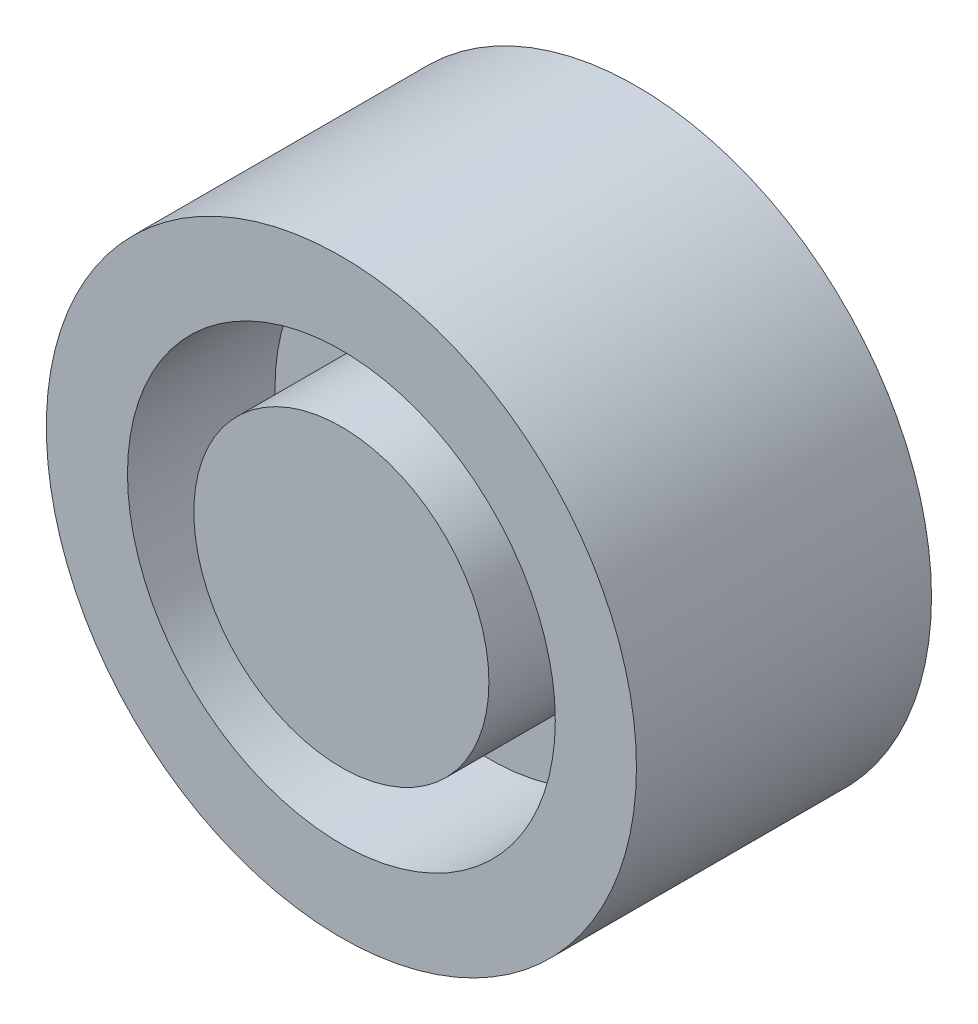
ISO-10303-21;
HEADER;
FILE_DESCRIPTION(('STEP AP214'),'2;1');
FILE_NAME('part.step','',(''),(''),'','','');
FILE_SCHEMA(('AUTOMOTIVE_DESIGN { 1 0 10303 214 1 1 1 1 }'));
ENDSEC;
DATA;
#1=APPLICATION_CONTEXT('core data for automotive mechanical design processes');
#2=APPLICATION_PROTOCOL_DEFINITION('international standard','automotive_design',2000,#1);
#3=PRODUCT_CONTEXT('',#1,'mechanical');
#4=PRODUCT('Part','Part','',(#3));
#5=PRODUCT_RELATED_PRODUCT_CATEGORY('part','',(#4));
#6=PRODUCT_DEFINITION_FORMATION('','',#4);
#7=PRODUCT_DEFINITION_CONTEXT('part definition',#1,'design');
#8=PRODUCT_DEFINITION('design','',#6,#7);
#9=PRODUCT_DEFINITION_SHAPE('','',#8);
#10=(LENGTH_UNIT() NAMED_UNIT(*) SI_UNIT(.MILLI.,.METRE.));
#11=(NAMED_UNIT(*) PLANE_ANGLE_UNIT() SI_UNIT($,.RADIAN.));
#12=(NAMED_UNIT(*) SI_UNIT($,.STERADIAN.) SOLID_ANGLE_UNIT());
#13=UNCERTAINTY_MEASURE_WITH_UNIT(LENGTH_MEASURE(1.E-05),#10,'distance_accuracy_value','');
#14=(GEOMETRIC_REPRESENTATION_CONTEXT(3) GLOBAL_UNCERTAINTY_ASSIGNED_CONTEXT((#13)) GLOBAL_UNIT_ASSIGNED_CONTEXT((#10,
#11,#12)) REPRESENTATION_CONTEXT('',''));
#15=CARTESIAN_POINT('',(0.,0.,0.));
#16=DIRECTION('',(0.,0.,1.));
#17=DIRECTION('',(1.,0.,0.));
#18=AXIS2_PLACEMENT_3D('',#15,#16,#17);
#19=CARTESIAN_POINT('',(0.,0.,2.));
#20=DIRECTION('',(0.,0.,-1.));
#21=DIRECTION('',(-1.,0.,0.));
#22=AXIS2_PLACEMENT_3D('',#19,#20,#21);
#23=CYLINDRICAL_SURFACE('',#22,2.);
#24=CARTESIAN_POINT('',(0.,0.,2.));
#25=DIRECTION('',(0.,0.,1.));
#26=DIRECTION('',(1.,0.,0.));
#27=AXIS2_PLACEMENT_3D('',#24,#25,#26);
#28=CIRCLE('',#27,2.);
#29=CARTESIAN_POINT('',(2.,0.,2.));
#30=VERTEX_POINT('',#29);
#31=EDGE_CURVE('E10',#30,#30,#28,.T.);
#32=ORIENTED_EDGE('',*,*,#31,.F.);
#33=EDGE_LOOP('',(#32));
#34=FACE_BOUND('',#33,.T.);
#35=CARTESIAN_POINT('',(0.,0.,0.));
#36=DIRECTION('',(0.,0.,1.));
#37=DIRECTION('',(1.,0.,0.));
#38=AXIS2_PLACEMENT_3D('',#35,#36,#37);
#39=CIRCLE('',#38,2.);
#40=CARTESIAN_POINT('',(2.,0.,0.));
#41=VERTEX_POINT('',#40);
#42=EDGE_CURVE('E39',#41,#41,#39,.T.);
#43=ORIENTED_EDGE('',*,*,#42,.T.);
#44=EDGE_LOOP('',(#43));
#45=FACE_BOUND('',#44,.T.);
#46=ADVANCED_FACE('F36',(#34,#45),#23,.T.);
#47=CARTESIAN_POINT('',(0.,0.,2.));
#48=DIRECTION('',(0.,0.,1.));
#49=DIRECTION('',(1.,0.,0.));
#50=AXIS2_PLACEMENT_3D('',#47,#48,#49);
#51=PLANE('',#50);
#52=CARTESIAN_POINT('',(0.,0.,2.));
#53=DIRECTION('',(0.,0.,1.));
#54=DIRECTION('',(1.,0.,0.));
#55=AXIS2_PLACEMENT_3D('',#52,#53,#54);
#56=CIRCLE('',#55,1.45);
#57=CARTESIAN_POINT('',(1.45,0.,2.));
#58=VERTEX_POINT('',#57);
#59=EDGE_CURVE('E50',#58,#58,#56,.T.);
#60=ORIENTED_EDGE('',*,*,#59,.F.);
#61=EDGE_LOOP('',(#60));
#62=FACE_BOUND('',#61,.T.);
#63=ORIENTED_EDGE('',*,*,#31,.T.);
#64=EDGE_LOOP('',(#63));
#65=FACE_BOUND('',#64,.T.);
#66=ADVANCED_FACE('F82',(#62,#65),#51,.T.);
#67=CARTESIAN_POINT('',(0.,0.,0.));
#68=DIRECTION('',(0.,0.,1.));
#69=DIRECTION('',(1.,0.,0.));
#70=AXIS2_PLACEMENT_3D('',#67,#68,#69);
#71=PLANE('',#70);
#72=ORIENTED_EDGE('',*,*,#42,.F.);
#73=EDGE_LOOP('',(#72));
#74=FACE_BOUND('',#73,.T.);
#75=ADVANCED_FACE('F78',(#74),#71,.F.);
#76=CARTESIAN_POINT('',(0.,0.,1.));
#77=DIRECTION('',(0.,0.,1.));
#78=DIRECTION('',(1.,0.,0.));
#79=AXIS2_PLACEMENT_3D('',#76,#77,#78);
#80=CYLINDRICAL_SURFACE('',#79,1.45);
#81=CARTESIAN_POINT('',(0.,0.,1.));
#82=DIRECTION('',(0.,0.,1.));
#83=DIRECTION('',(1.,0.,0.));
#84=AXIS2_PLACEMENT_3D('',#81,#82,#83);
#85=CIRCLE('',#84,1.45);
#86=CARTESIAN_POINT('',(1.45,0.,1.));
#87=VERTEX_POINT('',#86);
#88=EDGE_CURVE('E48',#87,#87,#85,.T.);
#89=ORIENTED_EDGE('',*,*,#88,.F.);
#90=EDGE_LOOP('',(#89));
#91=FACE_BOUND('',#90,.T.);
#92=ORIENTED_EDGE('',*,*,#59,.T.);
#93=EDGE_LOOP('',(#92));
#94=FACE_BOUND('',#93,.T.);
#95=ADVANCED_FACE('F72',(#91,#94),#80,.F.);
#96=CARTESIAN_POINT('',(0.,0.,1.));
#97=DIRECTION('',(0.,0.,1.));
#98=DIRECTION('',(1.,0.,0.));
#99=AXIS2_PLACEMENT_3D('',#96,#97,#98);
#100=PLANE('',#99);
#101=CARTESIAN_POINT('',(0.,0.,1.));
#102=DIRECTION('',(0.,0.,1.));
#103=DIRECTION('',(1.,0.,0.));
#104=AXIS2_PLACEMENT_3D('',#101,#102,#103);
#105=CIRCLE('',#104,1.);
#106=CARTESIAN_POINT('',(1.,0.,1.));
#107=VERTEX_POINT('',#106);
#108=EDGE_CURVE('E54',#107,#107,#105,.T.);
#109=ORIENTED_EDGE('',*,*,#108,.F.);
#110=EDGE_LOOP('',(#109));
#111=FACE_BOUND('',#110,.T.);
#112=ORIENTED_EDGE('',*,*,#88,.T.);
#113=EDGE_LOOP('',(#112));
#114=FACE_BOUND('',#113,.T.);
#115=ADVANCED_FACE('F69',(#111,#114),#100,.T.);
#116=CARTESIAN_POINT('',(0.,0.,1.));
#117=DIRECTION('',(0.,0.,1.));
#118=DIRECTION('',(1.,0.,0.));
#119=AXIS2_PLACEMENT_3D('',#116,#117,#118);
#120=CYLINDRICAL_SURFACE('',#119,1.);
#121=ORIENTED_EDGE('',*,*,#108,.T.);
#122=EDGE_LOOP('',(#121));
#123=FACE_BOUND('',#122,.T.);
#124=CARTESIAN_POINT('',(0.,0.,2.));
#125=DIRECTION('',(0.,0.,1.));
#126=DIRECTION('',(1.,0.,0.));
#127=AXIS2_PLACEMENT_3D('',#124,#125,#126);
#128=CIRCLE('',#127,1.);
#129=CARTESIAN_POINT('',(1.,0.,2.));
#130=VERTEX_POINT('',#129);
#131=EDGE_CURVE('E58',#130,#130,#128,.T.);
#132=ORIENTED_EDGE('',*,*,#131,.F.);
#133=EDGE_LOOP('',(#132));
#134=FACE_BOUND('',#133,.T.);
#135=ADVANCED_FACE('F66',(#123,#134),#120,.T.);
#136=ORIENTED_EDGE('',*,*,#131,.T.);
#137=EDGE_LOOP('',(#136));
#138=FACE_BOUND('',#137,.T.);
#139=ADVANCED_FACE('F85',(#138),#51,.T.);
#140=CLOSED_SHELL('',(#46,#66,#75,#95,#115,#135,#139));
#141=MANIFOLD_SOLID_BREP('B2',#140);
#142=ADVANCED_BREP_SHAPE_REPRESENTATION('',(#18,#141),#14);
#143=SHAPE_DEFINITION_REPRESENTATION(#9,#142);
ENDSEC;
END-ISO-10303-21;
